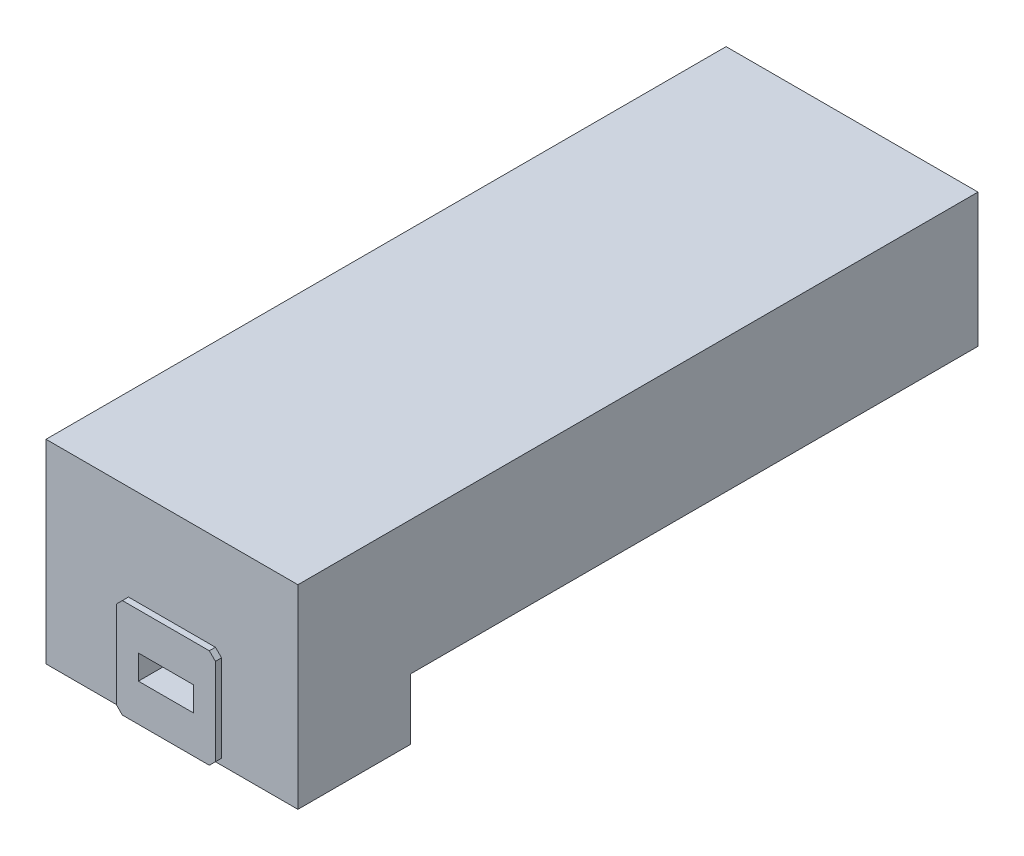
ISO-10303-21;
HEADER;
FILE_DESCRIPTION(('STEP AP214'),'2;1');
FILE_NAME('part.step','',(''),(''),'','','');
FILE_SCHEMA(('AUTOMOTIVE_DESIGN { 1 0 10303 214 1 1 1 1 }'));
ENDSEC;
DATA;
#1=APPLICATION_CONTEXT('core data for automotive mechanical design processes');
#2=APPLICATION_PROTOCOL_DEFINITION('international standard','automotive_design',2000,#1);
#3=PRODUCT_CONTEXT('',#1,'mechanical');
#4=PRODUCT('Part','Part','',(#3));
#5=PRODUCT_RELATED_PRODUCT_CATEGORY('part','',(#4));
#6=PRODUCT_DEFINITION_FORMATION('','',#4);
#7=PRODUCT_DEFINITION_CONTEXT('part definition',#1,'design');
#8=PRODUCT_DEFINITION('design','',#6,#7);
#9=PRODUCT_DEFINITION_SHAPE('','',#8);
#10=(LENGTH_UNIT() NAMED_UNIT(*) SI_UNIT(.MILLI.,.METRE.));
#11=(NAMED_UNIT(*) PLANE_ANGLE_UNIT() SI_UNIT($,.RADIAN.));
#12=(NAMED_UNIT(*) SI_UNIT($,.STERADIAN.) SOLID_ANGLE_UNIT());
#13=UNCERTAINTY_MEASURE_WITH_UNIT(LENGTH_MEASURE(1.E-05),#10,'distance_accuracy_value','');
#14=(GEOMETRIC_REPRESENTATION_CONTEXT(3) GLOBAL_UNCERTAINTY_ASSIGNED_CONTEXT((#13)) GLOBAL_UNIT_ASSIGNED_CONTEXT((#10,
#11,#12)) REPRESENTATION_CONTEXT('',''));
#15=CARTESIAN_POINT('',(0.,0.,0.));
#16=DIRECTION('',(0.,0.,1.));
#17=DIRECTION('',(1.,0.,0.));
#18=AXIS2_PLACEMENT_3D('',#15,#16,#17);
#19=CARTESIAN_POINT('',(-41.3,0.,0.));
#20=DIRECTION('',(0.,0.,1.));
#21=DIRECTION('',(1.,0.,0.));
#22=AXIS2_PLACEMENT_3D('',#19,#20,#21);
#23=PLANE('',#22);
#24=DIRECTION('',(0.,1.,0.));
#25=VECTOR('',#24,1.);
#26=CARTESIAN_POINT('',(-12.52,0.,0.));
#27=LINE('',#26,#25);
#28=CARTESIAN_POINT('',(-12.52,0.999999999999987,0.));
#29=VERTEX_POINT('',#28);
#30=CARTESIAN_POINT('',(-12.52,15.26,0.));
#31=VERTEX_POINT('',#30);
#32=EDGE_CURVE('E220',#29,#31,#27,.T.);
#33=ORIENTED_EDGE('',*,*,#32,.F.);
#34=DIRECTION('',(-0.707106781186552,-0.707106781186543,0.));
#35=VECTOR('',#34,1.);
#36=CARTESIAN_POINT('',(-12.52,0.999999999999987,0.));
#37=LINE('',#36,#35);
#38=CARTESIAN_POINT('',(-13.52,0.,0.));
#39=VERTEX_POINT('',#38);
#40=EDGE_CURVE('E357',#29,#39,#37,.T.);
#41=ORIENTED_EDGE('',*,*,#40,.T.);
#42=DIRECTION('',(1.,0.,0.));
#43=VECTOR('',#42,1.);
#44=CARTESIAN_POINT('',(-41.3,0.,0.));
#45=LINE('',#44,#43);
#46=CARTESIAN_POINT('',(0.,0.,0.));
#47=VERTEX_POINT('',#46);
#48=EDGE_CURVE('E294',#39,#47,#45,.T.);
#49=ORIENTED_EDGE('',*,*,#48,.T.);
#50=DIRECTION('',(0.,-1.,0.));
#51=VECTOR('',#50,1.);
#52=CARTESIAN_POINT('',(0.,0.,0.));
#53=LINE('',#52,#51);
#54=CARTESIAN_POINT('',(0.,31.9,0.));
#55=VERTEX_POINT('',#54);
#56=EDGE_CURVE('E272',#55,#47,#53,.T.);
#57=ORIENTED_EDGE('',*,*,#56,.F.);
#58=DIRECTION('',(1.,0.,0.));
#59=VECTOR('',#58,1.);
#60=CARTESIAN_POINT('',(-41.3,31.9,0.));
#61=LINE('',#60,#59);
#62=CARTESIAN_POINT('',(-41.3,31.9,0.));
#63=VERTEX_POINT('',#62);
#64=EDGE_CURVE('E308',#63,#55,#61,.T.);
#65=ORIENTED_EDGE('',*,*,#64,.F.);
#66=DIRECTION('',(0.,-1.,0.));
#67=VECTOR('',#66,1.);
#68=CARTESIAN_POINT('',(-41.3,0.,0.));
#69=LINE('',#68,#67);
#70=CARTESIAN_POINT('',(-41.3,0.,0.));
#71=VERTEX_POINT('',#70);
#72=EDGE_CURVE('E278',#63,#71,#69,.T.);
#73=ORIENTED_EDGE('',*,*,#72,.T.);
#74=CARTESIAN_POINT('',(-27.78,0.,0.));
#75=VERTEX_POINT('',#74);
#76=EDGE_CURVE('E316',#71,#75,#45,.T.);
#77=ORIENTED_EDGE('',*,*,#76,.T.);
#78=DIRECTION('',(-0.707106781186543,0.707106781186552,0.));
#79=VECTOR('',#78,1.);
#80=CARTESIAN_POINT('',(-27.78,0.,0.));
#81=LINE('',#80,#79);
#82=CARTESIAN_POINT('',(-28.78,0.999999999999987,0.));
#83=VERTEX_POINT('',#82);
#84=EDGE_CURVE('E361',#75,#83,#81,.T.);
#85=ORIENTED_EDGE('',*,*,#84,.T.);
#86=DIRECTION('',(0.,-1.,0.));
#87=VECTOR('',#86,1.);
#88=CARTESIAN_POINT('',(-28.78,0.,0.));
#89=LINE('',#88,#87);
#90=CARTESIAN_POINT('',(-28.78,15.26,0.));
#91=VERTEX_POINT('',#90);
#92=EDGE_CURVE('E231',#91,#83,#89,.T.);
#93=ORIENTED_EDGE('',*,*,#92,.F.);
#94=DIRECTION('',(-0.707106781186552,-0.707106781186543,0.));
#95=VECTOR('',#94,1.);
#96=CARTESIAN_POINT('',(-28.78,15.26,0.));
#97=LINE('',#96,#95);
#98=CARTESIAN_POINT('',(-27.78,16.26,0.));
#99=VERTEX_POINT('',#98);
#100=EDGE_CURVE('E55',#91,#99,#97,.F.);
#101=ORIENTED_EDGE('',*,*,#100,.T.);
#102=DIRECTION('',(-1.,0.,0.));
#103=VECTOR('',#102,1.);
#104=CARTESIAN_POINT('',(-28.78,16.26,0.));
#105=LINE('',#104,#103);
#106=CARTESIAN_POINT('',(-13.52,16.26,0.));
#107=VERTEX_POINT('',#106);
#108=EDGE_CURVE('E247',#107,#99,#105,.T.);
#109=ORIENTED_EDGE('',*,*,#108,.F.);
#110=DIRECTION('',(-0.707106781186547,0.707106781186547,0.));
#111=VECTOR('',#110,1.);
#112=CARTESIAN_POINT('',(-13.52,16.26,0.));
#113=LINE('',#112,#111);
#114=EDGE_CURVE('E11',#107,#31,#113,.F.);
#115=ORIENTED_EDGE('',*,*,#114,.T.);
#116=EDGE_LOOP('',(#33,#41,#49,#57,#65,#73,#77,#85,#93,#101,#109,#115));
#117=FACE_BOUND('',#116,.T.);
#118=ADVANCED_FACE('F45',(#117),#23,.T.);
#119=CARTESIAN_POINT('',(-41.3,31.9,0.));
#120=DIRECTION('',(0.,1.,0.));
#121=DIRECTION('',(0.,0.,1.));
#122=AXIS2_PLACEMENT_3D('',#119,#120,#121);
#123=PLANE('',#122);
#124=DIRECTION('',(0.,0.,1.));
#125=VECTOR('',#124,1.);
#126=CARTESIAN_POINT('',(0.,31.9,0.));
#127=LINE('',#126,#125);
#128=CARTESIAN_POINT('',(0.,31.9,-111.5));
#129=VERTEX_POINT('',#128);
#130=EDGE_CURVE('E283',#129,#55,#127,.T.);
#131=ORIENTED_EDGE('',*,*,#130,.F.);
#132=DIRECTION('',(1.,0.,0.));
#133=VECTOR('',#132,1.);
#134=CARTESIAN_POINT('',(-41.3,31.9,-111.5));
#135=LINE('',#134,#133);
#136=CARTESIAN_POINT('',(-41.3,31.9,-111.5));
#137=VERTEX_POINT('',#136);
#138=EDGE_CURVE('E312',#137,#129,#135,.T.);
#139=ORIENTED_EDGE('',*,*,#138,.F.);
#140=DIRECTION('',(0.,0.,1.));
#141=VECTOR('',#140,1.);
#142=CARTESIAN_POINT('',(-41.3,31.9,0.));
#143=LINE('',#142,#141);
#144=EDGE_CURVE('E290',#137,#63,#143,.T.);
#145=ORIENTED_EDGE('',*,*,#144,.T.);
#146=ORIENTED_EDGE('',*,*,#64,.T.);
#147=EDGE_LOOP('',(#131,#139,#145,#146));
#148=FACE_BOUND('',#147,.T.);
#149=ADVANCED_FACE('F379',(#148),#123,.T.);
#150=CARTESIAN_POINT('',(-41.3,0.,-111.5));
#151=DIRECTION('',(0.,0.,-1.));
#152=DIRECTION('',(-1.,0.,0.));
#153=AXIS2_PLACEMENT_3D('',#150,#151,#152);
#154=PLANE('',#153);
#155=DIRECTION('',(1.,0.,0.));
#156=VECTOR('',#155,1.);
#157=CARTESIAN_POINT('',(-41.3,10.,-111.5));
#158=LINE('',#157,#156);
#159=CARTESIAN_POINT('',(-41.3,10.,-111.5));
#160=VERTEX_POINT('',#159);
#161=CARTESIAN_POINT('',(0.,10.,-111.5));
#162=VERTEX_POINT('',#161);
#163=EDGE_CURVE('E262',#160,#162,#158,.T.);
#164=ORIENTED_EDGE('',*,*,#163,.F.);
#165=DIRECTION('',(0.,1.,0.));
#166=VECTOR('',#165,1.);
#167=CARTESIAN_POINT('',(-41.3,0.,-111.5));
#168=LINE('',#167,#166);
#169=EDGE_CURVE('E287',#160,#137,#168,.T.);
#170=ORIENTED_EDGE('',*,*,#169,.T.);
#171=ORIENTED_EDGE('',*,*,#138,.T.);
#172=DIRECTION('',(0.,1.,0.));
#173=VECTOR('',#172,1.);
#174=CARTESIAN_POINT('',(0.,0.,-111.5));
#175=LINE('',#174,#173);
#176=EDGE_CURVE('E302',#162,#129,#175,.T.);
#177=ORIENTED_EDGE('',*,*,#176,.F.);
#178=EDGE_LOOP('',(#164,#170,#171,#177));
#179=FACE_BOUND('',#178,.T.);
#180=ADVANCED_FACE('F429',(#179),#154,.T.);
#181=CARTESIAN_POINT('',(-41.3,0.,0.));
#182=DIRECTION('',(0.,-1.,0.));
#183=DIRECTION('',(0.,0.,-1.));
#184=AXIS2_PLACEMENT_3D('',#181,#182,#183);
#185=PLANE('',#184);
#186=ORIENTED_EDGE('',*,*,#48,.F.);
#187=DIRECTION('',(0.,0.,1.));
#188=VECTOR('',#187,1.);
#189=CARTESIAN_POINT('',(-13.52,0.,1.));
#190=LINE('',#189,#188);
#191=CARTESIAN_POINT('',(-13.52,0.,1.));
#192=VERTEX_POINT('',#191);
#193=EDGE_CURVE('E329',#39,#192,#190,.T.);
#194=ORIENTED_EDGE('',*,*,#193,.T.);
#195=DIRECTION('',(1.,0.,0.));
#196=VECTOR('',#195,1.);
#197=CARTESIAN_POINT('',(-28.78,0.,1.));
#198=LINE('',#197,#196);
#199=CARTESIAN_POINT('',(-27.78,0.,1.));
#200=VERTEX_POINT('',#199);
#201=EDGE_CURVE('E239',#200,#192,#198,.T.);
#202=ORIENTED_EDGE('',*,*,#201,.F.);
#203=DIRECTION('',(0.,0.,-1.));
#204=VECTOR('',#203,1.);
#205=CARTESIAN_POINT('',(-27.78,0.,0.));
#206=LINE('',#205,#204);
#207=EDGE_CURVE('E325',#200,#75,#206,.T.);
#208=ORIENTED_EDGE('',*,*,#207,.T.);
#209=ORIENTED_EDGE('',*,*,#76,.F.);
#210=DIRECTION('',(0.,0.,-1.));
#211=VECTOR('',#210,1.);
#212=CARTESIAN_POINT('',(-41.3,0.,0.));
#213=LINE('',#212,#211);
#214=CARTESIAN_POINT('',(-41.3,0.,-18.5));
#215=VERTEX_POINT('',#214);
#216=EDGE_CURVE('E282',#71,#215,#213,.T.);
#217=ORIENTED_EDGE('',*,*,#216,.T.);
#218=DIRECTION('',(1.,0.,0.));
#219=VECTOR('',#218,1.);
#220=CARTESIAN_POINT('',(-41.3,0.,-18.5));
#221=LINE('',#220,#219);
#222=CARTESIAN_POINT('',(0.,0.,-18.5));
#223=VERTEX_POINT('',#222);
#224=EDGE_CURVE('E268',#215,#223,#221,.T.);
#225=ORIENTED_EDGE('',*,*,#224,.T.);
#226=DIRECTION('',(0.,0.,-1.));
#227=VECTOR('',#226,1.);
#228=CARTESIAN_POINT('',(0.,0.,0.));
#229=LINE('',#228,#227);
#230=EDGE_CURVE('E298',#47,#223,#229,.T.);
#231=ORIENTED_EDGE('',*,*,#230,.F.);
#232=EDGE_LOOP('',(#186,#194,#202,#208,#209,#217,#225,#231));
#233=FACE_BOUND('',#232,.T.);
#234=ADVANCED_FACE('F370',(#233),#185,.T.);
#235=CARTESIAN_POINT('',(-41.3,0.,0.));
#236=DIRECTION('',(-1.,0.,0.));
#237=DIRECTION('',(0.,0.,1.));
#238=AXIS2_PLACEMENT_3D('',#235,#236,#237);
#239=PLANE('',#238);
#240=DIRECTION('',(0.,-1.,0.));
#241=VECTOR('',#240,1.);
#242=CARTESIAN_POINT('',(-41.3,0.,-18.5));
#243=LINE('',#242,#241);
#244=CARTESIAN_POINT('',(-41.3,10.,-18.5));
#245=VERTEX_POINT('',#244);
#246=EDGE_CURVE('E257',#245,#215,#243,.T.);
#247=ORIENTED_EDGE('',*,*,#246,.T.);
#248=ORIENTED_EDGE('',*,*,#216,.F.);
#249=ORIENTED_EDGE('',*,*,#72,.F.);
#250=ORIENTED_EDGE('',*,*,#144,.F.);
#251=ORIENTED_EDGE('',*,*,#169,.F.);
#252=DIRECTION('',(0.,0.,1.));
#253=VECTOR('',#252,1.);
#254=CARTESIAN_POINT('',(-41.3,10.,-18.5));
#255=LINE('',#254,#253);
#256=EDGE_CURVE('E253',#160,#245,#255,.T.);
#257=ORIENTED_EDGE('',*,*,#256,.T.);
#258=EDGE_LOOP('',(#247,#248,#249,#250,#251,#257));
#259=FACE_BOUND('',#258,.T.);
#260=ADVANCED_FACE('F384',(#259),#239,.T.);
#261=CARTESIAN_POINT('',(0.,0.,0.));
#262=DIRECTION('',(-1.,0.,0.));
#263=DIRECTION('',(0.,0.,1.));
#264=AXIS2_PLACEMENT_3D('',#261,#262,#263);
#265=PLANE('',#264);
#266=ORIENTED_EDGE('',*,*,#230,.T.);
#267=DIRECTION('',(0.,-1.,0.));
#268=VECTOR('',#267,1.);
#269=CARTESIAN_POINT('',(0.,0.,-18.5));
#270=LINE('',#269,#268);
#271=CARTESIAN_POINT('',(0.,10.,-18.5));
#272=VERTEX_POINT('',#271);
#273=EDGE_CURVE('E258',#272,#223,#270,.T.);
#274=ORIENTED_EDGE('',*,*,#273,.F.);
#275=DIRECTION('',(0.,0.,1.));
#276=VECTOR('',#275,1.);
#277=CARTESIAN_POINT('',(0.,10.,-18.5));
#278=LINE('',#277,#276);
#279=EDGE_CURVE('E243',#162,#272,#278,.T.);
#280=ORIENTED_EDGE('',*,*,#279,.F.);
#281=ORIENTED_EDGE('',*,*,#176,.T.);
#282=ORIENTED_EDGE('',*,*,#130,.T.);
#283=ORIENTED_EDGE('',*,*,#56,.T.);
#284=EDGE_LOOP('',(#266,#274,#280,#281,#282,#283));
#285=FACE_BOUND('',#284,.T.);
#286=ADVANCED_FACE('F373',(#285),#265,.F.);
#287=CARTESIAN_POINT('',(-41.3,0.,-18.5));
#288=DIRECTION('',(0.,0.,1.));
#289=DIRECTION('',(1.,0.,0.));
#290=AXIS2_PLACEMENT_3D('',#287,#288,#289);
#291=PLANE('',#290);
#292=ORIENTED_EDGE('',*,*,#273,.T.);
#293=ORIENTED_EDGE('',*,*,#224,.F.);
#294=ORIENTED_EDGE('',*,*,#246,.F.);
#295=DIRECTION('',(1.,0.,0.));
#296=VECTOR('',#295,1.);
#297=CARTESIAN_POINT('',(-41.3,10.,-18.5));
#298=LINE('',#297,#296);
#299=EDGE_CURVE('E273',#245,#272,#298,.T.);
#300=ORIENTED_EDGE('',*,*,#299,.T.);
#301=EDGE_LOOP('',(#292,#293,#294,#300));
#302=FACE_BOUND('',#301,.T.);
#303=ADVANCED_FACE('F439',(#302),#291,.F.);
#304=CARTESIAN_POINT('',(-41.3,10.,-18.5));
#305=DIRECTION('',(0.,1.,0.));
#306=DIRECTION('',(0.,0.,1.));
#307=AXIS2_PLACEMENT_3D('',#304,#305,#306);
#308=PLANE('',#307);
#309=ORIENTED_EDGE('',*,*,#279,.T.);
#310=ORIENTED_EDGE('',*,*,#299,.F.);
#311=ORIENTED_EDGE('',*,*,#256,.F.);
#312=ORIENTED_EDGE('',*,*,#163,.T.);
#313=EDGE_LOOP('',(#309,#310,#311,#312));
#314=FACE_BOUND('',#313,.T.);
#315=ADVANCED_FACE('F442',(#314),#308,.F.);
#316=CARTESIAN_POINT('',(-12.52,0.,1.));
#317=DIRECTION('',(-1.,0.,0.));
#318=DIRECTION('',(0.,-1.,0.));
#319=AXIS2_PLACEMENT_3D('',#316,#317,#318);
#320=PLANE('',#319);
#321=DIRECTION('',(0.,1.,0.));
#322=VECTOR('',#321,1.);
#323=CARTESIAN_POINT('',(-12.52,0.,1.));
#324=LINE('',#323,#322);
#325=CARTESIAN_POINT('',(-12.52,0.999999999999987,1.));
#326=VERTEX_POINT('',#325);
#327=CARTESIAN_POINT('',(-12.52,15.26,1.));
#328=VERTEX_POINT('',#327);
#329=EDGE_CURVE('E226',#326,#328,#324,.T.);
#330=ORIENTED_EDGE('',*,*,#329,.F.);
#331=DIRECTION('',(0.,0.,-1.));
#332=VECTOR('',#331,1.);
#333=CARTESIAN_POINT('',(-12.52,0.999999999999987,0.));
#334=LINE('',#333,#332);
#335=EDGE_CURVE('E321',#326,#29,#334,.T.);
#336=ORIENTED_EDGE('',*,*,#335,.T.);
#337=ORIENTED_EDGE('',*,*,#32,.T.);
#338=DIRECTION('',(0.,0.,1.));
#339=VECTOR('',#338,1.);
#340=CARTESIAN_POINT('',(-12.52,15.26,1.));
#341=LINE('',#340,#339);
#342=EDGE_CURVE('E311',#31,#328,#341,.T.);
#343=ORIENTED_EDGE('',*,*,#342,.T.);
#344=EDGE_LOOP('',(#330,#336,#337,#343));
#345=FACE_BOUND('',#344,.T.);
#346=ADVANCED_FACE('F409',(#345),#320,.F.);
#347=CARTESIAN_POINT('',(-28.78,16.26,1.));
#348=DIRECTION('',(0.,-1.,0.));
#349=DIRECTION('',(1.,0.,0.));
#350=AXIS2_PLACEMENT_3D('',#347,#348,#349);
#351=PLANE('',#350);
#352=ORIENTED_EDGE('',*,*,#108,.T.);
#353=DIRECTION('',(0.,0.,1.));
#354=VECTOR('',#353,1.);
#355=CARTESIAN_POINT('',(-27.78,16.26,1.));
#356=LINE('',#355,#354);
#357=CARTESIAN_POINT('',(-27.78,16.26,1.));
#358=VERTEX_POINT('',#357);
#359=EDGE_CURVE('E354',#99,#358,#356,.T.);
#360=ORIENTED_EDGE('',*,*,#359,.T.);
#361=DIRECTION('',(-1.,0.,0.));
#362=VECTOR('',#361,1.);
#363=CARTESIAN_POINT('',(-28.78,16.26,1.));
#364=LINE('',#363,#362);
#365=CARTESIAN_POINT('',(-13.52,16.26,1.));
#366=VERTEX_POINT('',#365);
#367=EDGE_CURVE('E230',#366,#358,#364,.T.);
#368=ORIENTED_EDGE('',*,*,#367,.F.);
#369=DIRECTION('',(0.,0.,-1.));
#370=VECTOR('',#369,1.);
#371=CARTESIAN_POINT('',(-13.52,16.26,1.));
#372=LINE('',#371,#370);
#373=EDGE_CURVE('E351',#366,#107,#372,.T.);
#374=ORIENTED_EDGE('',*,*,#373,.T.);
#375=EDGE_LOOP('',(#352,#360,#368,#374));
#376=FACE_BOUND('',#375,.T.);
#377=ADVANCED_FACE('F406',(#376),#351,.F.);
#378=CARTESIAN_POINT('',(-28.78,0.,1.));
#379=DIRECTION('',(1.,0.,0.));
#380=DIRECTION('',(0.,0.,-1.));
#381=AXIS2_PLACEMENT_3D('',#378,#379,#380);
#382=PLANE('',#381);
#383=ORIENTED_EDGE('',*,*,#92,.T.);
#384=DIRECTION('',(0.,0.,1.));
#385=VECTOR('',#384,1.);
#386=CARTESIAN_POINT('',(-28.78,0.999999999999987,1.));
#387=LINE('',#386,#385);
#388=CARTESIAN_POINT('',(-28.78,0.999999999999987,1.));
#389=VERTEX_POINT('',#388);
#390=EDGE_CURVE('E348',#83,#389,#387,.T.);
#391=ORIENTED_EDGE('',*,*,#390,.T.);
#392=DIRECTION('',(0.,-1.,0.));
#393=VECTOR('',#392,1.);
#394=CARTESIAN_POINT('',(-28.78,0.,1.));
#395=LINE('',#394,#393);
#396=CARTESIAN_POINT('',(-28.78,15.26,1.));
#397=VERTEX_POINT('',#396);
#398=EDGE_CURVE('E235',#397,#389,#395,.T.);
#399=ORIENTED_EDGE('',*,*,#398,.F.);
#400=DIRECTION('',(0.,0.,-1.));
#401=VECTOR('',#400,1.);
#402=CARTESIAN_POINT('',(-28.78,15.26,1.));
#403=LINE('',#402,#401);
#404=EDGE_CURVE('E344',#397,#91,#403,.T.);
#405=ORIENTED_EDGE('',*,*,#404,.T.);
#406=EDGE_LOOP('',(#383,#391,#399,#405));
#407=FACE_BOUND('',#406,.T.);
#408=ADVANCED_FACE('F396',(#407),#382,.F.);
#409=CARTESIAN_POINT('',(0.,0.,1.));
#410=DIRECTION('',(0.,0.,-1.));
#411=DIRECTION('',(-1.,0.,0.));
#412=AXIS2_PLACEMENT_3D('',#409,#410,#411);
#413=PLANE('',#412);
#414=DIRECTION('',(-1.,0.,0.));
#415=VECTOR('',#414,1.);
#416=CARTESIAN_POINT('',(-25.15,10.13,1.));
#417=LINE('',#416,#415);
#418=CARTESIAN_POINT('',(-16.15,10.13,1.));
#419=VERTEX_POINT('',#418);
#420=CARTESIAN_POINT('',(-25.15,10.13,1.));
#421=VERTEX_POINT('',#420);
#422=EDGE_CURVE('E211',#419,#421,#417,.T.);
#423=ORIENTED_EDGE('',*,*,#422,.F.);
#424=DIRECTION('',(0.,1.,0.));
#425=VECTOR('',#424,1.);
#426=CARTESIAN_POINT('',(-16.15,6.13000000000001,1.));
#427=LINE('',#426,#425);
#428=CARTESIAN_POINT('',(-16.15,6.13000000000001,1.));
#429=VERTEX_POINT('',#428);
#430=EDGE_CURVE('E178',#429,#419,#427,.T.);
#431=ORIENTED_EDGE('',*,*,#430,.F.);
#432=DIRECTION('',(1.,0.,0.));
#433=VECTOR('',#432,1.);
#434=CARTESIAN_POINT('',(-25.15,6.13000000000001,1.));
#435=LINE('',#434,#433);
#436=CARTESIAN_POINT('',(-25.15,6.13000000000001,1.));
#437=VERTEX_POINT('',#436);
#438=EDGE_CURVE('E198',#437,#429,#435,.T.);
#439=ORIENTED_EDGE('',*,*,#438,.F.);
#440=DIRECTION('',(0.,-1.,0.));
#441=VECTOR('',#440,1.);
#442=CARTESIAN_POINT('',(-25.15,6.13000000000001,1.));
#443=LINE('',#442,#441);
#444=EDGE_CURVE('E202',#421,#437,#443,.T.);
#445=ORIENTED_EDGE('',*,*,#444,.F.);
#446=EDGE_LOOP('',(#423,#431,#439,#445));
#447=FACE_BOUND('',#446,.T.);
#448=ORIENTED_EDGE('',*,*,#201,.T.);
#449=DIRECTION('',(0.707106781186552,0.707106781186543,0.));
#450=VECTOR('',#449,1.);
#451=CARTESIAN_POINT('',(-12.52,0.999999999999987,1.));
#452=LINE('',#451,#450);
#453=EDGE_CURVE('E341',#192,#326,#452,.T.);
#454=ORIENTED_EDGE('',*,*,#453,.T.);
#455=ORIENTED_EDGE('',*,*,#329,.T.);
#456=DIRECTION('',(0.707106781186548,-0.707106781186548,0.));
#457=VECTOR('',#456,1.);
#458=CARTESIAN_POINT('',(-13.52,16.26,1.));
#459=LINE('',#458,#457);
#460=EDGE_CURVE('E332',#328,#366,#459,.F.);
#461=ORIENTED_EDGE('',*,*,#460,.T.);
#462=ORIENTED_EDGE('',*,*,#367,.T.);
#463=DIRECTION('',(0.707106781186552,0.707106781186543,0.));
#464=VECTOR('',#463,1.);
#465=CARTESIAN_POINT('',(-28.78,15.26,1.));
#466=LINE('',#465,#464);
#467=EDGE_CURVE('E335',#358,#397,#466,.F.);
#468=ORIENTED_EDGE('',*,*,#467,.T.);
#469=ORIENTED_EDGE('',*,*,#398,.T.);
#470=DIRECTION('',(0.707106781186543,-0.707106781186552,0.));
#471=VECTOR('',#470,1.);
#472=CARTESIAN_POINT('',(-27.78,0.,1.));
#473=LINE('',#472,#471);
#474=EDGE_CURVE('E338',#389,#200,#473,.T.);
#475=ORIENTED_EDGE('',*,*,#474,.T.);
#476=EDGE_LOOP('',(#448,#454,#455,#461,#462,#468,#469,#475));
#477=FACE_BOUND('',#476,.T.);
#478=ADVANCED_FACE('F399',(#447,#477),#413,.F.);
#479=CARTESIAN_POINT('',(-16.15,6.13000000000001,-14.));
#480=DIRECTION('',(1.,0.,0.));
#481=DIRECTION('',(0.,0.,-1.));
#482=AXIS2_PLACEMENT_3D('',#479,#480,#481);
#483=PLANE('',#482);
#484=ORIENTED_EDGE('',*,*,#430,.T.);
#485=DIRECTION('',(0.,0.,1.));
#486=VECTOR('',#485,1.);
#487=CARTESIAN_POINT('',(-16.15,10.13,-14.));
#488=LINE('',#487,#486);
#489=CARTESIAN_POINT('',(-16.15,10.13,-14.));
#490=VERTEX_POINT('',#489);
#491=EDGE_CURVE('E171',#490,#419,#488,.T.);
#492=ORIENTED_EDGE('',*,*,#491,.F.);
#493=DIRECTION('',(0.,1.,0.));
#494=VECTOR('',#493,1.);
#495=CARTESIAN_POINT('',(-16.15,6.13000000000001,-14.));
#496=LINE('',#495,#494);
#497=CARTESIAN_POINT('',(-16.15,6.13000000000001,-14.));
#498=VERTEX_POINT('',#497);
#499=EDGE_CURVE('E175',#498,#490,#496,.T.);
#500=ORIENTED_EDGE('',*,*,#499,.F.);
#501=DIRECTION('',(0.,0.,1.));
#502=VECTOR('',#501,1.);
#503=CARTESIAN_POINT('',(-16.15,6.13000000000001,-14.));
#504=LINE('',#503,#502);
#505=EDGE_CURVE('E217',#498,#429,#504,.T.);
#506=ORIENTED_EDGE('',*,*,#505,.T.);
#507=EDGE_LOOP('',(#484,#492,#500,#506));
#508=FACE_BOUND('',#507,.T.);
#509=ADVANCED_FACE('F173',(#508),#483,.F.);
#510=CARTESIAN_POINT('',(-25.15,6.13000000000001,-14.));
#511=DIRECTION('',(0.,-1.,0.));
#512=DIRECTION('',(0.,0.,-1.));
#513=AXIS2_PLACEMENT_3D('',#510,#511,#512);
#514=PLANE('',#513);
#515=ORIENTED_EDGE('',*,*,#438,.T.);
#516=ORIENTED_EDGE('',*,*,#505,.F.);
#517=DIRECTION('',(1.,0.,0.));
#518=VECTOR('',#517,1.);
#519=CARTESIAN_POINT('',(-25.15,6.13000000000001,-14.));
#520=LINE('',#519,#518);
#521=CARTESIAN_POINT('',(-25.15,6.13000000000001,-14.));
#522=VERTEX_POINT('',#521);
#523=EDGE_CURVE('E184',#522,#498,#520,.T.);
#524=ORIENTED_EDGE('',*,*,#523,.F.);
#525=DIRECTION('',(0.,0.,1.));
#526=VECTOR('',#525,1.);
#527=CARTESIAN_POINT('',(-25.15,6.13000000000001,-14.));
#528=LINE('',#527,#526);
#529=EDGE_CURVE('E221',#522,#437,#528,.T.);
#530=ORIENTED_EDGE('',*,*,#529,.T.);
#531=EDGE_LOOP('',(#515,#516,#524,#530));
#532=FACE_BOUND('',#531,.T.);
#533=ADVANCED_FACE('F460',(#532),#514,.F.);
#534=CARTESIAN_POINT('',(-25.15,6.13000000000001,-14.));
#535=DIRECTION('',(-1.,0.,0.));
#536=DIRECTION('',(0.,0.,1.));
#537=AXIS2_PLACEMENT_3D('',#534,#535,#536);
#538=PLANE('',#537);
#539=ORIENTED_EDGE('',*,*,#444,.T.);
#540=ORIENTED_EDGE('',*,*,#529,.F.);
#541=DIRECTION('',(0.,-1.,0.));
#542=VECTOR('',#541,1.);
#543=CARTESIAN_POINT('',(-25.15,6.13000000000001,-14.));
#544=LINE('',#543,#542);
#545=CARTESIAN_POINT('',(-25.15,10.13,-14.));
#546=VERTEX_POINT('',#545);
#547=EDGE_CURVE('E193',#546,#522,#544,.T.);
#548=ORIENTED_EDGE('',*,*,#547,.F.);
#549=DIRECTION('',(0.,0.,1.));
#550=VECTOR('',#549,1.);
#551=CARTESIAN_POINT('',(-25.15,10.13,-14.));
#552=LINE('',#551,#550);
#553=EDGE_CURVE('E183',#546,#421,#552,.T.);
#554=ORIENTED_EDGE('',*,*,#553,.T.);
#555=EDGE_LOOP('',(#539,#540,#548,#554));
#556=FACE_BOUND('',#555,.T.);
#557=ADVANCED_FACE('F463',(#556),#538,.F.);
#558=CARTESIAN_POINT('',(-25.15,10.13,-14.));
#559=DIRECTION('',(0.,1.,0.));
#560=DIRECTION('',(0.,0.,1.));
#561=AXIS2_PLACEMENT_3D('',#558,#559,#560);
#562=PLANE('',#561);
#563=ORIENTED_EDGE('',*,*,#422,.T.);
#564=ORIENTED_EDGE('',*,*,#553,.F.);
#565=DIRECTION('',(-1.,0.,0.));
#566=VECTOR('',#565,1.);
#567=CARTESIAN_POINT('',(-25.15,10.13,-14.));
#568=LINE('',#567,#566);
#569=EDGE_CURVE('E187',#490,#546,#568,.T.);
#570=ORIENTED_EDGE('',*,*,#569,.F.);
#571=ORIENTED_EDGE('',*,*,#491,.T.);
#572=EDGE_LOOP('',(#563,#564,#570,#571));
#573=FACE_BOUND('',#572,.T.);
#574=ADVANCED_FACE('F188',(#573),#562,.F.);
#575=CARTESIAN_POINT('',(0.,0.,-14.));
#576=DIRECTION('',(0.,0.,-1.));
#577=DIRECTION('',(-1.,0.,0.));
#578=AXIS2_PLACEMENT_3D('',#575,#576,#577);
#579=PLANE('',#578);
#580=ORIENTED_EDGE('',*,*,#499,.T.);
#581=ORIENTED_EDGE('',*,*,#569,.T.);
#582=ORIENTED_EDGE('',*,*,#547,.T.);
#583=ORIENTED_EDGE('',*,*,#523,.T.);
#584=EDGE_LOOP('',(#580,#581,#582,#583));
#585=FACE_BOUND('',#584,.T.);
#586=ADVANCED_FACE('F195',(#585),#579,.F.);
#587=CARTESIAN_POINT('',(-12.52,0.999999999999987,1.));
#588=DIRECTION('',(0.707106781186543,-0.707106781186552,0.));
#589=DIRECTION('',(0.,0.,1.));
#590=AXIS2_PLACEMENT_3D('',#587,#588,#589);
#591=PLANE('',#590);
#592=ORIENTED_EDGE('',*,*,#453,.F.);
#593=ORIENTED_EDGE('',*,*,#193,.F.);
#594=ORIENTED_EDGE('',*,*,#40,.F.);
#595=ORIENTED_EDGE('',*,*,#335,.F.);
#596=EDGE_LOOP('',(#592,#593,#594,#595));
#597=FACE_BOUND('',#596,.T.);
#598=ADVANCED_FACE('F414',(#597),#591,.T.);
#599=CARTESIAN_POINT('',(-27.78,0.,0.));
#600=DIRECTION('',(-0.707106781186552,-0.707106781186543,0.));
#601=DIRECTION('',(0.,0.,1.));
#602=AXIS2_PLACEMENT_3D('',#599,#600,#601);
#603=PLANE('',#602);
#604=ORIENTED_EDGE('',*,*,#474,.F.);
#605=ORIENTED_EDGE('',*,*,#390,.F.);
#606=ORIENTED_EDGE('',*,*,#84,.F.);
#607=ORIENTED_EDGE('',*,*,#207,.F.);
#608=EDGE_LOOP('',(#604,#605,#606,#607));
#609=FACE_BOUND('',#608,.T.);
#610=ADVANCED_FACE('F393',(#609),#603,.T.);
#611=CARTESIAN_POINT('',(-28.78,15.26,1.));
#612=DIRECTION('',(0.707106781186543,-0.707106781186552,0.));
#613=DIRECTION('',(0.,0.,-1.));
#614=AXIS2_PLACEMENT_3D('',#611,#612,#613);
#615=PLANE('',#614);
#616=ORIENTED_EDGE('',*,*,#467,.F.);
#617=ORIENTED_EDGE('',*,*,#359,.F.);
#618=ORIENTED_EDGE('',*,*,#100,.F.);
#619=ORIENTED_EDGE('',*,*,#404,.F.);
#620=EDGE_LOOP('',(#616,#617,#618,#619));
#621=FACE_BOUND('',#620,.T.);
#622=ADVANCED_FACE('F404',(#621),#615,.F.);
#623=CARTESIAN_POINT('',(-13.52,16.26,1.));
#624=DIRECTION('',(-0.707106781186547,-0.707106781186547,0.));
#625=DIRECTION('',(0.,0.,-1.));
#626=AXIS2_PLACEMENT_3D('',#623,#624,#625);
#627=PLANE('',#626);
#628=ORIENTED_EDGE('',*,*,#460,.F.);
#629=ORIENTED_EDGE('',*,*,#342,.F.);
#630=ORIENTED_EDGE('',*,*,#114,.F.);
#631=ORIENTED_EDGE('',*,*,#373,.F.);
#632=EDGE_LOOP('',(#628,#629,#630,#631));
#633=FACE_BOUND('',#632,.T.);
#634=ADVANCED_FACE('F48',(#633),#627,.F.);
#635=CLOSED_SHELL('',(#118,#149,#180,#234,#260,#286,#303,#315,#346,#377,#408,#478,#509,#533,
#557,#574,#586,#598,#610,#622,#634));
#636=MANIFOLD_SOLID_BREP('B2',#635);
#637=ADVANCED_BREP_SHAPE_REPRESENTATION('',(#18,#636),#14);
#638=SHAPE_DEFINITION_REPRESENTATION(#9,#637);
ENDSEC;
END-ISO-10303-21;
